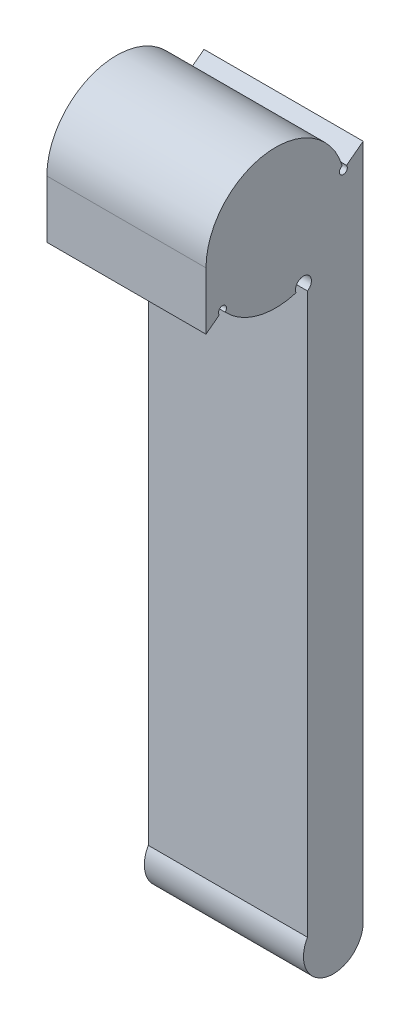
ISO-10303-21;
HEADER;
FILE_DESCRIPTION(('STEP AP214'),'2;1');
FILE_NAME('part.step','',(''),(''),'','','');
FILE_SCHEMA(('AUTOMOTIVE_DESIGN { 1 0 10303 214 1 1 1 1 }'));
ENDSEC;
DATA;
#1=APPLICATION_CONTEXT('core data for automotive mechanical design processes');
#2=APPLICATION_PROTOCOL_DEFINITION('international standard','automotive_design',2000,#1);
#3=PRODUCT_CONTEXT('',#1,'mechanical');
#4=PRODUCT('Part','Part','',(#3));
#5=PRODUCT_RELATED_PRODUCT_CATEGORY('part','',(#4));
#6=PRODUCT_DEFINITION_FORMATION('','',#4);
#7=PRODUCT_DEFINITION_CONTEXT('part definition',#1,'design');
#8=PRODUCT_DEFINITION('design','',#6,#7);
#9=PRODUCT_DEFINITION_SHAPE('','',#8);
#10=(LENGTH_UNIT() NAMED_UNIT(*) SI_UNIT(.MILLI.,.METRE.));
#11=(NAMED_UNIT(*) PLANE_ANGLE_UNIT() SI_UNIT($,.RADIAN.));
#12=(NAMED_UNIT(*) SI_UNIT($,.STERADIAN.) SOLID_ANGLE_UNIT());
#13=UNCERTAINTY_MEASURE_WITH_UNIT(LENGTH_MEASURE(1.E-05),#10,'distance_accuracy_value','');
#14=(GEOMETRIC_REPRESENTATION_CONTEXT(3) GLOBAL_UNCERTAINTY_ASSIGNED_CONTEXT((#13)) GLOBAL_UNIT_ASSIGNED_CONTEXT((#10,
#11,#12)) REPRESENTATION_CONTEXT('',''));
#15=CARTESIAN_POINT('',(0.,0.,0.));
#16=DIRECTION('',(0.,0.,1.));
#17=DIRECTION('',(1.,0.,0.));
#18=AXIS2_PLACEMENT_3D('',#15,#16,#17);
#19=CARTESIAN_POINT('',(8.,24.6660852895481,-18.7607709992157));
#20=DIRECTION('',(-1.,0.,0.));
#21=DIRECTION('',(0.,0.,1.));
#22=AXIS2_PLACEMENT_3D('',#19,#20,#21);
#23=CYLINDRICAL_SURFACE('',#22,3.5);
#24=DIRECTION('',(-1.,0.,0.));
#25=VECTOR('',#24,1.);
#26=CARTESIAN_POINT('',(8.,21.3194926586248,-19.7856211163791));
#27=LINE('',#26,#25);
#28=CARTESIAN_POINT('',(8.,21.3194926586248,-19.7856211163791));
#29=VERTEX_POINT('',#28);
#30=CARTESIAN_POINT('',(0.,21.3194926586248,-19.7856211163791));
#31=VERTEX_POINT('',#30);
#32=EDGE_CURVE('E154',#29,#31,#27,.T.);
#33=ORIENTED_EDGE('',*,*,#32,.F.);
#34=CARTESIAN_POINT('',(8.,24.6660852895481,-18.7607709992157));
#35=DIRECTION('',(1.,0.,0.));
#36=DIRECTION('',(0.,0.,-1.));
#37=AXIS2_PLACEMENT_3D('',#34,#35,#36);
#38=CIRCLE('',#37,3.5);
#39=CARTESIAN_POINT('',(8.,22.2546155338927,-16.2240775574377));
#40=VERTEX_POINT('',#39);
#41=EDGE_CURVE('E150',#40,#29,#38,.T.);
#42=ORIENTED_EDGE('',*,*,#41,.F.);
#43=DIRECTION('',(-1.,0.,0.));
#44=VECTOR('',#43,1.);
#45=CARTESIAN_POINT('',(8.,22.2546155338927,-16.2240775574377));
#46=LINE('',#45,#44);
#47=CARTESIAN_POINT('',(0.,22.2546155338927,-16.2240775574377));
#48=VERTEX_POINT('',#47);
#49=EDGE_CURVE('E164',#40,#48,#46,.T.);
#50=ORIENTED_EDGE('',*,*,#49,.T.);
#51=CARTESIAN_POINT('',(0.,24.6660852895481,-18.7607709992157));
#52=DIRECTION('',(1.,0.,0.));
#53=DIRECTION('',(0.,0.,-1.));
#54=AXIS2_PLACEMENT_3D('',#51,#52,#53);
#55=CIRCLE('',#54,3.5);
#56=EDGE_CURVE('E182',#48,#31,#55,.T.);
#57=ORIENTED_EDGE('',*,*,#56,.T.);
#58=EDGE_LOOP('',(#33,#42,#50,#57));
#59=FACE_BOUND('',#58,.T.);
#60=ADVANCED_FACE('F42',(#59),#23,.T.);
#61=CARTESIAN_POINT('',(8.,-7.7712668114183,-21.6607709992157));
#62=DIRECTION('',(-1.,0.,0.));
#63=DIRECTION('',(0.,0.,1.));
#64=AXIS2_PLACEMENT_3D('',#61,#62,#63);
#65=CYLINDRICAL_SURFACE('',#64,1.5);
#66=CARTESIAN_POINT('',(0.,-7.7712668114183,-21.6607709992157));
#67=DIRECTION('',(1.,0.,0.));
#68=DIRECTION('',(0.,0.,-1.));
#69=AXIS2_PLACEMENT_3D('',#66,#67,#68);
#70=CIRCLE('',#69,1.5);
#71=CARTESIAN_POINT('',(0.,-7.02293533406352,-20.3607709992157));
#72=VERTEX_POINT('',#71);
#73=CARTESIAN_POINT('',(0.,-7.7712668114183,-23.1607709992157));
#74=VERTEX_POINT('',#73);
#75=EDGE_CURVE('E160',#72,#74,#70,.T.);
#76=ORIENTED_EDGE('',*,*,#75,.T.);
#77=DIRECTION('',(-1.,0.,0.));
#78=VECTOR('',#77,1.);
#79=CARTESIAN_POINT('',(8.,-7.7712668114183,-23.1607709992157));
#80=LINE('',#79,#78);
#81=CARTESIAN_POINT('',(8.,-7.7712668114183,-23.1607709992157));
#82=VERTEX_POINT('',#81);
#83=EDGE_CURVE('E11',#82,#74,#80,.T.);
#84=ORIENTED_EDGE('',*,*,#83,.F.);
#85=CARTESIAN_POINT('',(8.,-7.7712668114183,-21.6607709992157));
#86=DIRECTION('',(1.,0.,0.));
#87=DIRECTION('',(0.,0.,-1.));
#88=AXIS2_PLACEMENT_3D('',#85,#86,#87);
#89=CIRCLE('',#88,1.5);
#90=CARTESIAN_POINT('',(8.,-7.02293533406352,-20.3607709992157));
#91=VERTEX_POINT('',#90);
#92=EDGE_CURVE('E179',#91,#82,#89,.T.);
#93=ORIENTED_EDGE('',*,*,#92,.F.);
#94=DIRECTION('',(-1.,0.,0.));
#95=VECTOR('',#94,1.);
#96=CARTESIAN_POINT('',(8.,-7.02293533406352,-20.3607709992157));
#97=LINE('',#96,#95);
#98=EDGE_CURVE('E135',#91,#72,#97,.T.);
#99=ORIENTED_EDGE('',*,*,#98,.T.);
#100=EDGE_LOOP('',(#76,#84,#93,#99));
#101=FACE_BOUND('',#100,.T.);
#102=ADVANCED_FACE('F46',(#101),#65,.T.);
#103=CARTESIAN_POINT('',(8.,0.,-23.1607709992157));
#104=DIRECTION('',(0.,0.,-1.));
#105=DIRECTION('',(0.,1.,0.));
#106=AXIS2_PLACEMENT_3D('',#103,#104,#105);
#107=PLANE('',#106);
#108=DIRECTION('',(0.,-1.,0.));
#109=VECTOR('',#108,1.);
#110=CARTESIAN_POINT('',(0.,0.,-23.1607709992157));
#111=LINE('',#110,#109);
#112=CARTESIAN_POINT('',(0.,26.2287331885817,-23.1607709992157));
#113=VERTEX_POINT('',#112);
#114=EDGE_CURVE('E196',#113,#74,#111,.T.);
#115=ORIENTED_EDGE('',*,*,#114,.F.);
#116=DIRECTION('',(-1.,0.,0.));
#117=VECTOR('',#116,1.);
#118=CARTESIAN_POINT('',(8.,26.2287331885817,-23.1607709992157));
#119=LINE('',#118,#117);
#120=CARTESIAN_POINT('',(8.,26.2287331885817,-23.1607709992157));
#121=VERTEX_POINT('',#120);
#122=EDGE_CURVE('E52',#121,#113,#119,.T.);
#123=ORIENTED_EDGE('',*,*,#122,.F.);
#124=DIRECTION('',(0.,-1.,0.));
#125=VECTOR('',#124,1.);
#126=CARTESIAN_POINT('',(8.,0.,-23.1607709992157));
#127=LINE('',#126,#125);
#128=EDGE_CURVE('E178',#121,#82,#127,.T.);
#129=ORIENTED_EDGE('',*,*,#128,.T.);
#130=ORIENTED_EDGE('',*,*,#83,.T.);
#131=EDGE_LOOP('',(#115,#123,#129,#130));
#132=FACE_BOUND('',#131,.T.);
#133=ADVANCED_FACE('F221',(#132),#107,.T.);
#134=CARTESIAN_POINT('',(8.,5.59739492058324,4.21793961243036));
#135=DIRECTION('',(0.,0.798635510047289,0.601815023152053));
#136=DIRECTION('',(0.,-0.601815023152053,0.798635510047289));
#137=AXIS2_PLACEMENT_3D('',#134,#135,#136);
#138=PLANE('',#137);
#139=DIRECTION('',(-1.,0.,0.));
#140=VECTOR('',#139,1.);
#141=CARTESIAN_POINT('',(8.,25.5988626086814,-22.324904507868));
#142=LINE('',#141,#140);
#143=CARTESIAN_POINT('',(8.,25.5988626086814,-22.324904507868));
#144=VERTEX_POINT('',#143);
#145=CARTESIAN_POINT('',(0.,25.5988626086814,-22.324904507868));
#146=VERTEX_POINT('',#145);
#147=EDGE_CURVE('E70',#144,#146,#142,.T.);
#148=ORIENTED_EDGE('',*,*,#147,.F.);
#149=DIRECTION('',(0.,0.601815023152053,-0.798635510047289));
#150=VECTOR('',#149,1.);
#151=CARTESIAN_POINT('',(8.,5.59739492058324,4.21793961243036));
#152=LINE('',#151,#150);
#153=EDGE_CURVE('E183',#144,#121,#152,.T.);
#154=ORIENTED_EDGE('',*,*,#153,.T.);
#155=ORIENTED_EDGE('',*,*,#122,.T.);
#156=DIRECTION('',(0.,0.601815023152053,-0.798635510047289));
#157=VECTOR('',#156,1.);
#158=CARTESIAN_POINT('',(0.,5.59739492058324,4.21793961243036));
#159=LINE('',#158,#157);
#160=EDGE_CURVE('E205',#146,#113,#159,.T.);
#161=ORIENTED_EDGE('',*,*,#160,.F.);
#162=EDGE_LOOP('',(#148,#154,#155,#161));
#163=FACE_BOUND('',#162,.T.);
#164=ADVANCED_FACE('F219',(#163),#138,.T.);
#165=CARTESIAN_POINT('',(8.,25.6716313030083,-22.11321446851));
#166=VERTEX_POINT('',#165);
#167=CARTESIAN_POINT('',(8.,24.6660852895481,-15.2607709992157));
#168=VERTEX_POINT('',#167);
#169=EDGE_CURVE('E186',#166,#168,#38,.T.);
#170=ORIENTED_EDGE('',*,*,#169,.F.);
#171=DIRECTION('',(-1.,0.,0.));
#172=VECTOR('',#171,1.);
#173=CARTESIAN_POINT('',(8.,25.6716313030083,-22.11321446851));
#174=LINE('',#173,#172);
#175=CARTESIAN_POINT('',(0.,25.6716313030083,-22.11321446851));
#176=VERTEX_POINT('',#175);
#177=EDGE_CURVE('E153',#166,#176,#174,.T.);
#178=ORIENTED_EDGE('',*,*,#177,.T.);
#179=CARTESIAN_POINT('',(0.,24.6660852895481,-15.2607709992157));
#180=VERTEX_POINT('',#179);
#181=EDGE_CURVE('E204',#176,#180,#55,.T.);
#182=ORIENTED_EDGE('',*,*,#181,.T.);
#183=DIRECTION('',(-1.,0.,0.));
#184=VECTOR('',#183,1.);
#185=CARTESIAN_POINT('',(8.,24.6660852895481,-15.2607709992157));
#186=LINE('',#185,#184);
#187=EDGE_CURVE('E213',#168,#180,#186,.T.);
#188=ORIENTED_EDGE('',*,*,#187,.F.);
#189=EDGE_LOOP('',(#170,#178,#182,#188));
#190=FACE_BOUND('',#189,.T.);
#191=ADVANCED_FACE('F235',(#190),#23,.T.);
#192=CARTESIAN_POINT('',(8.,0.,-15.2607709992156));
#193=DIRECTION('',(0.,0.,-1.));
#194=DIRECTION('',(0.,1.,0.));
#195=AXIS2_PLACEMENT_3D('',#192,#193,#194);
#196=PLANE('',#195);
#197=DIRECTION('',(0.,-1.,0.));
#198=VECTOR('',#197,1.);
#199=CARTESIAN_POINT('',(0.,0.,-15.2607709992156));
#200=LINE('',#199,#198);
#201=CARTESIAN_POINT('',(0.,21.778218982557,-15.2607709992157));
#202=VERTEX_POINT('',#201);
#203=EDGE_CURVE('E206',#180,#202,#200,.T.);
#204=ORIENTED_EDGE('',*,*,#203,.T.);
#205=DIRECTION('',(-1.,0.,0.));
#206=VECTOR('',#205,1.);
#207=CARTESIAN_POINT('',(8.,21.778218982557,-15.2607709992157));
#208=LINE('',#207,#206);
#209=CARTESIAN_POINT('',(8.,21.778218982557,-15.2607709992157));
#210=VERTEX_POINT('',#209);
#211=EDGE_CURVE('E188',#210,#202,#208,.T.);
#212=ORIENTED_EDGE('',*,*,#211,.F.);
#213=DIRECTION('',(0.,-1.,0.));
#214=VECTOR('',#213,1.);
#215=CARTESIAN_POINT('',(8.,0.,-15.2607709992156));
#216=LINE('',#215,#214);
#217=EDGE_CURVE('E191',#168,#210,#216,.T.);
#218=ORIENTED_EDGE('',*,*,#217,.F.);
#219=ORIENTED_EDGE('',*,*,#187,.T.);
#220=EDGE_LOOP('',(#204,#212,#218,#219));
#221=FACE_BOUND('',#220,.T.);
#222=ADVANCED_FACE('F238',(#221),#196,.F.);
#223=CARTESIAN_POINT('',(8.,6.55575753264002,4.94011764021284));
#224=DIRECTION('',(0.,0.79863551004729,0.601815023152052));
#225=DIRECTION('',(0.,-0.601815023152052,0.79863551004729));
#226=AXIS2_PLACEMENT_3D('',#223,#224,#225);
#227=PLANE('',#226);
#228=DIRECTION('',(0.,0.601815023152052,-0.79863551004729));
#229=VECTOR('',#228,1.);
#230=CARTESIAN_POINT('',(0.,6.55575753264002,4.94011764021284));
#231=LINE('',#230,#229);
#232=CARTESIAN_POINT('',(0.,22.2830843567586,-15.9307499796653));
#233=VERTEX_POINT('',#232);
#234=EDGE_CURVE('E208',#202,#233,#231,.T.);
#235=ORIENTED_EDGE('',*,*,#234,.T.);
#236=DIRECTION('',(-1.,0.,0.));
#237=VECTOR('',#236,1.);
#238=CARTESIAN_POINT('',(8.,22.2830843567586,-15.9307499796653));
#239=LINE('',#238,#237);
#240=CARTESIAN_POINT('',(8.,22.2830843567586,-15.9307499796653));
#241=VERTEX_POINT('',#240);
#242=EDGE_CURVE('E174',#241,#233,#239,.T.);
#243=ORIENTED_EDGE('',*,*,#242,.F.);
#244=DIRECTION('',(0.,0.601815023152052,-0.79863551004729));
#245=VECTOR('',#244,1.);
#246=CARTESIAN_POINT('',(8.,6.55575753264002,4.94011764021284));
#247=LINE('',#246,#245);
#248=EDGE_CURVE('E187',#210,#241,#247,.T.);
#249=ORIENTED_EDGE('',*,*,#248,.F.);
#250=ORIENTED_EDGE('',*,*,#211,.T.);
#251=EDGE_LOOP('',(#235,#243,#249,#250));
#252=FACE_BOUND('',#251,.T.);
#253=ADVANCED_FACE('F243',(#252),#227,.F.);
#254=CARTESIAN_POINT('',(8.,0.,0.));
#255=DIRECTION('',(1.,0.,0.));
#256=DIRECTION('',(0.,0.,-1.));
#257=AXIS2_PLACEMENT_3D('',#254,#255,#256);
#258=PLANE('',#257);
#259=DIRECTION('',(0.,-1.,0.));
#260=VECTOR('',#259,1.);
#261=CARTESIAN_POINT('',(8.,0.,-20.3607709992157));
#262=LINE('',#261,#260);
#263=CARTESIAN_POINT('',(8.,21.1118721415652,-20.3607709992157));
#264=VERTEX_POINT('',#263);
#265=EDGE_CURVE('E133',#264,#91,#262,.T.);
#266=ORIENTED_EDGE('',*,*,#265,.T.);
#267=ORIENTED_EDGE('',*,*,#92,.T.);
#268=ORIENTED_EDGE('',*,*,#128,.F.);
#269=ORIENTED_EDGE('',*,*,#153,.F.);
#270=CARTESIAN_POINT('',(8.,25.478499604051,-22.1651774058585));
#271=DIRECTION('',(-1.,0.,0.));
#272=DIRECTION('',(0.,0.,1.));
#273=AXIS2_PLACEMENT_3D('',#270,#271,#272);
#274=CIRCLE('',#273,0.199999999999999);
#275=EDGE_CURVE('E159',#144,#166,#274,.T.);
#276=ORIENTED_EDGE('',*,*,#275,.T.);
#277=ORIENTED_EDGE('',*,*,#169,.T.);
#278=ORIENTED_EDGE('',*,*,#217,.T.);
#279=ORIENTED_EDGE('',*,*,#248,.T.);
#280=CARTESIAN_POINT('',(8.,22.403447361389,-16.0904770816748));
#281=DIRECTION('',(-1.,0.,0.));
#282=DIRECTION('',(0.,0.,1.));
#283=AXIS2_PLACEMENT_3D('',#280,#281,#282);
#284=CIRCLE('',#283,0.200000000000002);
#285=EDGE_CURVE('E166',#241,#40,#284,.T.);
#286=ORIENTED_EDGE('',*,*,#285,.T.);
#287=ORIENTED_EDGE('',*,*,#41,.T.);
#288=CARTESIAN_POINT('',(8.,21.458282303079,-20.1607709992157));
#289=DIRECTION('',(-1.,0.,0.));
#290=DIRECTION('',(0.,0.,1.));
#291=AXIS2_PLACEMENT_3D('',#288,#289,#290);
#292=CIRCLE('',#291,0.4);
#293=EDGE_CURVE('E126',#264,#29,#292,.F.);
#294=ORIENTED_EDGE('',*,*,#293,.F.);
#295=EDGE_LOOP('',(#266,#267,#268,#269,#276,#277,#278,#279,#286,#287,#294));
#296=FACE_BOUND('',#295,.T.);
#297=ADVANCED_FACE('F145',(#296),#258,.T.);
#298=CARTESIAN_POINT('',(0.,0.,0.));
#299=DIRECTION('',(1.,0.,0.));
#300=DIRECTION('',(0.,0.,-1.));
#301=AXIS2_PLACEMENT_3D('',#298,#299,#300);
#302=PLANE('',#301);
#303=ORIENTED_EDGE('',*,*,#75,.F.);
#304=DIRECTION('',(0.,-1.,0.));
#305=VECTOR('',#304,1.);
#306=CARTESIAN_POINT('',(0.,0.,-20.3607709992157));
#307=LINE('',#306,#305);
#308=CARTESIAN_POINT('',(0.,21.1118721415652,-20.3607709992157));
#309=VERTEX_POINT('',#308);
#310=EDGE_CURVE('E146',#309,#72,#307,.T.);
#311=ORIENTED_EDGE('',*,*,#310,.F.);
#312=CARTESIAN_POINT('',(0.,21.458282303079,-20.1607709992157));
#313=DIRECTION('',(-1.,0.,0.));
#314=DIRECTION('',(0.,0.,1.));
#315=AXIS2_PLACEMENT_3D('',#312,#313,#314);
#316=CIRCLE('',#315,0.4);
#317=EDGE_CURVE('E58',#309,#31,#316,.F.);
#318=ORIENTED_EDGE('',*,*,#317,.T.);
#319=ORIENTED_EDGE('',*,*,#56,.F.);
#320=CARTESIAN_POINT('',(0.,22.403447361389,-16.0904770816748));
#321=DIRECTION('',(-1.,0.,0.));
#322=DIRECTION('',(0.,0.,1.));
#323=AXIS2_PLACEMENT_3D('',#320,#321,#322);
#324=CIRCLE('',#323,0.200000000000002);
#325=EDGE_CURVE('E171',#233,#48,#324,.T.);
#326=ORIENTED_EDGE('',*,*,#325,.F.);
#327=ORIENTED_EDGE('',*,*,#234,.F.);
#328=ORIENTED_EDGE('',*,*,#203,.F.);
#329=ORIENTED_EDGE('',*,*,#181,.F.);
#330=CARTESIAN_POINT('',(0.,25.478499604051,-22.1651774058585));
#331=DIRECTION('',(-1.,0.,0.));
#332=DIRECTION('',(0.,0.,1.));
#333=AXIS2_PLACEMENT_3D('',#330,#331,#332);
#334=CIRCLE('',#333,0.199999999999999);
#335=EDGE_CURVE('E162',#146,#176,#334,.T.);
#336=ORIENTED_EDGE('',*,*,#335,.F.);
#337=ORIENTED_EDGE('',*,*,#160,.T.);
#338=ORIENTED_EDGE('',*,*,#114,.T.);
#339=EDGE_LOOP('',(#303,#311,#318,#319,#326,#327,#328,#329,#336,#337,#338));
#340=FACE_BOUND('',#339,.T.);
#341=ADVANCED_FACE('F226',(#340),#302,.F.);
#342=CARTESIAN_POINT('',(8.,22.403447361389,-16.0904770816748));
#343=DIRECTION('',(-1.,0.,0.));
#344=DIRECTION('',(0.,0.,1.));
#345=AXIS2_PLACEMENT_3D('',#342,#343,#344);
#346=CYLINDRICAL_SURFACE('',#345,0.200000000000002);
#347=ORIENTED_EDGE('',*,*,#325,.T.);
#348=ORIENTED_EDGE('',*,*,#49,.F.);
#349=ORIENTED_EDGE('',*,*,#285,.F.);
#350=ORIENTED_EDGE('',*,*,#242,.T.);
#351=EDGE_LOOP('',(#347,#348,#349,#350));
#352=FACE_BOUND('',#351,.T.);
#353=ADVANCED_FACE('F263',(#352),#346,.F.);
#354=CARTESIAN_POINT('',(8.,25.478499604051,-22.1651774058585));
#355=DIRECTION('',(-1.,0.,0.));
#356=DIRECTION('',(0.,0.,1.));
#357=AXIS2_PLACEMENT_3D('',#354,#355,#356);
#358=CYLINDRICAL_SURFACE('',#357,0.199999999999999);
#359=ORIENTED_EDGE('',*,*,#335,.T.);
#360=ORIENTED_EDGE('',*,*,#177,.F.);
#361=ORIENTED_EDGE('',*,*,#275,.F.);
#362=ORIENTED_EDGE('',*,*,#147,.T.);
#363=EDGE_LOOP('',(#359,#360,#361,#362));
#364=FACE_BOUND('',#363,.T.);
#365=ADVANCED_FACE('F227',(#364),#358,.F.);
#366=CARTESIAN_POINT('',(8.,21.458282303079,-20.1607709992157));
#367=DIRECTION('',(-1.,0.,0.));
#368=DIRECTION('',(0.,0.,1.));
#369=AXIS2_PLACEMENT_3D('',#366,#367,#368);
#370=CYLINDRICAL_SURFACE('',#369,0.4);
#371=ORIENTED_EDGE('',*,*,#317,.F.);
#372=DIRECTION('',(-1.,0.,0.));
#373=VECTOR('',#372,1.);
#374=CARTESIAN_POINT('',(8.,21.1118721415652,-20.3607709992157));
#375=LINE('',#374,#373);
#376=EDGE_CURVE('E121',#264,#309,#375,.T.);
#377=ORIENTED_EDGE('',*,*,#376,.F.);
#378=ORIENTED_EDGE('',*,*,#293,.T.);
#379=ORIENTED_EDGE('',*,*,#32,.T.);
#380=EDGE_LOOP('',(#371,#377,#378,#379));
#381=FACE_BOUND('',#380,.T.);
#382=ADVANCED_FACE('F127',(#381),#370,.F.);
#383=CARTESIAN_POINT('',(8.,0.,-20.3607709992157));
#384=DIRECTION('',(0.,0.,-1.));
#385=DIRECTION('',(0.,1.,0.));
#386=AXIS2_PLACEMENT_3D('',#383,#384,#385);
#387=PLANE('',#386);
#388=ORIENTED_EDGE('',*,*,#310,.T.);
#389=ORIENTED_EDGE('',*,*,#98,.F.);
#390=ORIENTED_EDGE('',*,*,#265,.F.);
#391=ORIENTED_EDGE('',*,*,#376,.T.);
#392=EDGE_LOOP('',(#388,#389,#390,#391));
#393=FACE_BOUND('',#392,.T.);
#394=ADVANCED_FACE('F139',(#393),#387,.F.);
#395=CLOSED_SHELL('',(#60,#102,#133,#164,#191,#222,#253,#297,#341,#353,#365,#382,#394));
#396=MANIFOLD_SOLID_BREP('B2',#395);
#397=ADVANCED_BREP_SHAPE_REPRESENTATION('',(#18,#396),#14);
#398=SHAPE_DEFINITION_REPRESENTATION(#9,#397);
ENDSEC;
END-ISO-10303-21;
